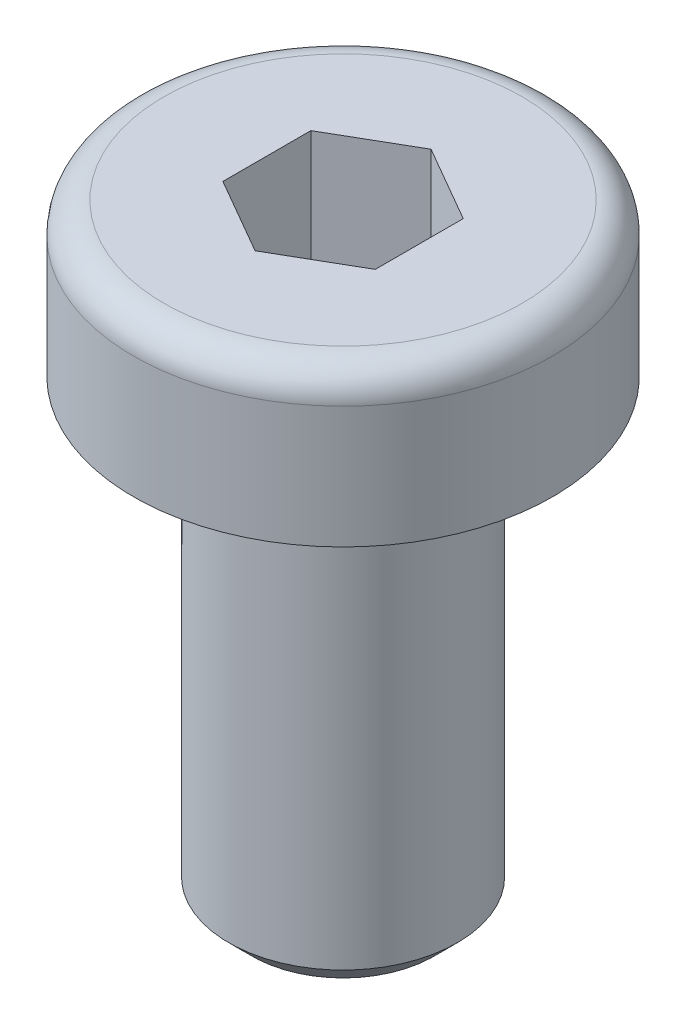
ISO-10303-21;
HEADER;
FILE_DESCRIPTION(('STEP AP214'),'2;1');
FILE_NAME('part.step','',(''),(''),'','','');
FILE_SCHEMA(('AUTOMOTIVE_DESIGN { 1 0 10303 214 1 1 1 1 }'));
ENDSEC;
DATA;
#1=APPLICATION_CONTEXT('core data for automotive mechanical design processes');
#2=APPLICATION_PROTOCOL_DEFINITION('international standard','automotive_design',2000,#1);
#3=PRODUCT_CONTEXT('',#1,'mechanical');
#4=PRODUCT('Part','Part','',(#3));
#5=PRODUCT_RELATED_PRODUCT_CATEGORY('part','',(#4));
#6=PRODUCT_DEFINITION_FORMATION('','',#4);
#7=PRODUCT_DEFINITION_CONTEXT('part definition',#1,'design');
#8=PRODUCT_DEFINITION('design','',#6,#7);
#9=PRODUCT_DEFINITION_SHAPE('','',#8);
#10=(LENGTH_UNIT() NAMED_UNIT(*) SI_UNIT(.MILLI.,.METRE.));
#11=(NAMED_UNIT(*) PLANE_ANGLE_UNIT() SI_UNIT($,.RADIAN.));
#12=(NAMED_UNIT(*) SI_UNIT($,.STERADIAN.) SOLID_ANGLE_UNIT());
#13=UNCERTAINTY_MEASURE_WITH_UNIT(LENGTH_MEASURE(1.E-05),#10,'distance_accuracy_value','');
#14=(GEOMETRIC_REPRESENTATION_CONTEXT(3) GLOBAL_UNCERTAINTY_ASSIGNED_CONTEXT((#13)) GLOBAL_UNIT_ASSIGNED_CONTEXT((#10,
#11,#12)) REPRESENTATION_CONTEXT('',''));
#15=CARTESIAN_POINT('',(0.,0.,0.));
#16=DIRECTION('',(0.,0.,1.));
#17=DIRECTION('',(1.,0.,0.));
#18=AXIS2_PLACEMENT_3D('',#15,#16,#17);
#19=CARTESIAN_POINT('',(0.,2.,0.));
#20=DIRECTION('',(0.,-1.,0.));
#21=DIRECTION('',(0.,0.,-1.));
#22=AXIS2_PLACEMENT_3D('',#19,#20,#21);
#23=PLANE('',#22);
#24=CARTESIAN_POINT('',(0.,2.,0.));
#25=DIRECTION('',(0.,-1.,0.));
#26=DIRECTION('',(0.,0.,-1.));
#27=AXIS2_PLACEMENT_3D('',#24,#25,#26);
#28=CIRCLE('',#27,2.3500000059604);
#29=CARTESIAN_POINT('',(0.,2.,-2.3500000059604));
#30=VERTEX_POINT('',#29);
#31=EDGE_CURVE('E92',#30,#30,#28,.T.);
#32=ORIENTED_EDGE('',*,*,#31,.F.);
#33=EDGE_LOOP('',(#32));
#34=FACE_BOUND('',#33,.T.);
#35=DIRECTION('',(0.,0.,1.));
#36=VECTOR('',#35,1.);
#37=CARTESIAN_POINT('',(-1.,2.,-0.57735026918963));
#38=LINE('',#37,#36);
#39=CARTESIAN_POINT('',(-1.,2.,-0.57735026918963));
#40=VERTEX_POINT('',#39);
#41=CARTESIAN_POINT('',(-1.,2.,0.57735026918963));
#42=VERTEX_POINT('',#41);
#43=EDGE_CURVE('E78',#40,#42,#38,.T.);
#44=ORIENTED_EDGE('',*,*,#43,.F.);
#45=DIRECTION('',(-0.866025403784422,0.,0.500000000000029));
#46=VECTOR('',#45,1.);
#47=CARTESIAN_POINT('',(0.,2.,-1.1547005383793));
#48=LINE('',#47,#46);
#49=CARTESIAN_POINT('',(0.,2.,-1.1547005383793));
#50=VERTEX_POINT('',#49);
#51=EDGE_CURVE('E67',#50,#40,#48,.T.);
#52=ORIENTED_EDGE('',*,*,#51,.F.);
#53=DIRECTION('',(-0.866025403784422,0.,-0.500000000000029));
#54=VECTOR('',#53,1.);
#55=CARTESIAN_POINT('',(1.,2.,-0.57735026918963));
#56=LINE('',#55,#54);
#57=CARTESIAN_POINT('',(1.,2.,-0.57735026918963));
#58=VERTEX_POINT('',#57);
#59=EDGE_CURVE('E77',#58,#50,#56,.T.);
#60=ORIENTED_EDGE('',*,*,#59,.F.);
#61=DIRECTION('',(0.,0.,-1.));
#62=VECTOR('',#61,1.);
#63=CARTESIAN_POINT('',(1.,2.,0.57735026918963));
#64=LINE('',#63,#62);
#65=CARTESIAN_POINT('',(1.,2.,0.57735026918963));
#66=VERTEX_POINT('',#65);
#67=EDGE_CURVE('E102',#66,#58,#64,.T.);
#68=ORIENTED_EDGE('',*,*,#67,.F.);
#69=DIRECTION('',(0.866025403784422,0.,-0.500000000000029));
#70=VECTOR('',#69,1.);
#71=CARTESIAN_POINT('',(0.,2.,1.1547005383793));
#72=LINE('',#71,#70);
#73=CARTESIAN_POINT('',(0.,2.,1.1547005383793));
#74=VERTEX_POINT('',#73);
#75=EDGE_CURVE('E107',#74,#66,#72,.T.);
#76=ORIENTED_EDGE('',*,*,#75,.F.);
#77=DIRECTION('',(0.866025403784422,0.,0.500000000000029));
#78=VECTOR('',#77,1.);
#79=CARTESIAN_POINT('',(-1.,2.,0.57735026918963));
#80=LINE('',#79,#78);
#81=EDGE_CURVE('E91',#42,#74,#80,.T.);
#82=ORIENTED_EDGE('',*,*,#81,.F.);
#83=EDGE_LOOP('',(#44,#52,#60,#68,#76,#82));
#84=FACE_BOUND('',#83,.T.);
#85=ADVANCED_FACE('F16',(#34,#84),#23,.F.);
#86=CARTESIAN_POINT('',(0.,1.59999999999994,0.));
#87=DIRECTION('',(0.,-1.,0.));
#88=DIRECTION('',(0.,0.,-1.));
#89=AXIS2_PLACEMENT_3D('',#86,#87,#88);
#90=TOROIDAL_SURFACE('',#89,2.34999999999994,0.400000000000065);
#91=ORIENTED_EDGE('',*,*,#31,.T.);
#92=EDGE_LOOP('',(#91));
#93=FACE_BOUND('',#92,.T.);
#94=CARTESIAN_POINT('',(0.,1.6,0.));
#95=DIRECTION('',(0.,-1.,0.));
#96=DIRECTION('',(0.,0.,-1.));
#97=AXIS2_PLACEMENT_3D('',#94,#95,#96);
#98=CIRCLE('',#97,2.75);
#99=CARTESIAN_POINT('',(0.,1.6,-2.75));
#100=VERTEX_POINT('',#99);
#101=EDGE_CURVE('E115',#100,#100,#98,.T.);
#102=ORIENTED_EDGE('',*,*,#101,.F.);
#103=EDGE_LOOP('',(#102));
#104=FACE_BOUND('',#103,.T.);
#105=ADVANCED_FACE('F190',(#93,#104),#90,.T.);
#106=CARTESIAN_POINT('',(0.,0.,0.));
#107=DIRECTION('',(0.,-1.,0.));
#108=DIRECTION('',(0.,0.,-1.));
#109=AXIS2_PLACEMENT_3D('',#106,#107,#108);
#110=CYLINDRICAL_SURFACE('',#109,2.75);
#111=CARTESIAN_POINT('',(0.,0.,0.));
#112=DIRECTION('',(0.,-1.,0.));
#113=DIRECTION('',(0.,0.,-1.));
#114=AXIS2_PLACEMENT_3D('',#111,#112,#113);
#115=CIRCLE('',#114,2.75);
#116=CARTESIAN_POINT('',(0.,0.,-2.75));
#117=VERTEX_POINT('',#116);
#118=EDGE_CURVE('E120',#117,#117,#115,.T.);
#119=ORIENTED_EDGE('',*,*,#118,.F.);
#120=EDGE_LOOP('',(#119));
#121=FACE_BOUND('',#120,.T.);
#122=ORIENTED_EDGE('',*,*,#101,.T.);
#123=EDGE_LOOP('',(#122));
#124=FACE_BOUND('',#123,.T.);
#125=ADVANCED_FACE('F184',(#121,#124),#110,.T.);
#126=CARTESIAN_POINT('',(2.75,0.,0.));
#127=DIRECTION('',(0.,1.,0.));
#128=DIRECTION('',(0.,0.,1.));
#129=AXIS2_PLACEMENT_3D('',#126,#127,#128);
#130=PLANE('',#129);
#131=CARTESIAN_POINT('',(0.,0.,0.));
#132=DIRECTION('',(0.,-1.,0.));
#133=DIRECTION('',(0.,0.,-1.));
#134=AXIS2_PLACEMENT_3D('',#131,#132,#133);
#135=CIRCLE('',#134,1.5);
#136=CARTESIAN_POINT('',(0.,0.,-1.5));
#137=VERTEX_POINT('',#136);
#138=EDGE_CURVE('E123',#137,#137,#135,.T.);
#139=ORIENTED_EDGE('',*,*,#138,.F.);
#140=EDGE_LOOP('',(#139));
#141=FACE_BOUND('',#140,.T.);
#142=ORIENTED_EDGE('',*,*,#118,.T.);
#143=EDGE_LOOP('',(#142));
#144=FACE_BOUND('',#143,.T.);
#145=ADVANCED_FACE('F181',(#141,#144),#130,.F.);
#146=CARTESIAN_POINT('',(-1.,3.5,-0.57735026918963));
#147=DIRECTION('',(1.,0.,0.));
#148=DIRECTION('',(0.,0.,-1.));
#149=AXIS2_PLACEMENT_3D('',#146,#147,#148);
#150=PLANE('',#149);
#151=ORIENTED_EDGE('',*,*,#43,.T.);
#152=DIRECTION('',(0.,-1.,0.));
#153=VECTOR('',#152,1.);
#154=CARTESIAN_POINT('',(-1.,2.,0.57735026918963));
#155=LINE('',#154,#153);
#156=CARTESIAN_POINT('',(-1.,0.5,0.57735026918963));
#157=VERTEX_POINT('',#156);
#158=EDGE_CURVE('E126',#42,#157,#155,.T.);
#159=ORIENTED_EDGE('',*,*,#158,.T.);
#160=DIRECTION('',(0.,0.,1.));
#161=VECTOR('',#160,1.);
#162=CARTESIAN_POINT('',(-1.,0.5,-0.57735026918963));
#163=LINE('',#162,#161);
#164=CARTESIAN_POINT('',(-1.,0.5,-0.57735026918963));
#165=VERTEX_POINT('',#164);
#166=EDGE_CURVE('E85',#165,#157,#163,.T.);
#167=ORIENTED_EDGE('',*,*,#166,.F.);
#168=DIRECTION('',(0.,-1.,0.));
#169=VECTOR('',#168,1.);
#170=CARTESIAN_POINT('',(-1.,2.,-0.57735026918963));
#171=LINE('',#170,#169);
#172=EDGE_CURVE('E70',#40,#165,#171,.T.);
#173=ORIENTED_EDGE('',*,*,#172,.F.);
#174=EDGE_LOOP('',(#151,#159,#167,#173));
#175=FACE_BOUND('',#174,.T.);
#176=ADVANCED_FACE('F83',(#175),#150,.T.);
#177=CARTESIAN_POINT('',(-1.,3.5,0.57735026918963));
#178=DIRECTION('',(0.500000000000029,0.,-0.866025403784422));
#179=DIRECTION('',(-0.866025403784422,0.,-0.500000000000029));
#180=AXIS2_PLACEMENT_3D('',#177,#178,#179);
#181=PLANE('',#180);
#182=ORIENTED_EDGE('',*,*,#81,.T.);
#183=DIRECTION('',(0.,-1.,0.));
#184=VECTOR('',#183,1.);
#185=CARTESIAN_POINT('',(0.,2.,1.1547005383793));
#186=LINE('',#185,#184);
#187=CARTESIAN_POINT('',(0.,0.5,1.1547005383793));
#188=VERTEX_POINT('',#187);
#189=EDGE_CURVE('E86',#74,#188,#186,.T.);
#190=ORIENTED_EDGE('',*,*,#189,.T.);
#191=DIRECTION('',(0.866025403784422,0.,0.500000000000029));
#192=VECTOR('',#191,1.);
#193=CARTESIAN_POINT('',(-1.,0.5,0.57735026918963));
#194=LINE('',#193,#192);
#195=EDGE_CURVE('E137',#157,#188,#194,.T.);
#196=ORIENTED_EDGE('',*,*,#195,.F.);
#197=ORIENTED_EDGE('',*,*,#158,.F.);
#198=EDGE_LOOP('',(#182,#190,#196,#197));
#199=FACE_BOUND('',#198,.T.);
#200=ADVANCED_FACE('F206',(#199),#181,.T.);
#201=CARTESIAN_POINT('',(0.,3.5,1.1547005383793));
#202=DIRECTION('',(-0.500000000000029,0.,-0.866025403784422));
#203=DIRECTION('',(-0.866025403784422,0.,0.500000000000029));
#204=AXIS2_PLACEMENT_3D('',#201,#202,#203);
#205=PLANE('',#204);
#206=ORIENTED_EDGE('',*,*,#75,.T.);
#207=DIRECTION('',(0.,-1.,0.));
#208=VECTOR('',#207,1.);
#209=CARTESIAN_POINT('',(1.,2.,0.57735026918963));
#210=LINE('',#209,#208);
#211=CARTESIAN_POINT('',(1.,0.5,0.57735026918963));
#212=VERTEX_POINT('',#211);
#213=EDGE_CURVE('E141',#66,#212,#210,.T.);
#214=ORIENTED_EDGE('',*,*,#213,.T.);
#215=DIRECTION('',(0.866025403784422,0.,-0.500000000000029));
#216=VECTOR('',#215,1.);
#217=CARTESIAN_POINT('',(0.,0.5,1.1547005383793));
#218=LINE('',#217,#216);
#219=EDGE_CURVE('E146',#188,#212,#218,.T.);
#220=ORIENTED_EDGE('',*,*,#219,.F.);
#221=ORIENTED_EDGE('',*,*,#189,.F.);
#222=EDGE_LOOP('',(#206,#214,#220,#221));
#223=FACE_BOUND('',#222,.T.);
#224=ADVANCED_FACE('F209',(#223),#205,.T.);
#225=CARTESIAN_POINT('',(1.,3.5,0.57735026918963));
#226=DIRECTION('',(-1.,0.,0.));
#227=DIRECTION('',(0.,0.,1.));
#228=AXIS2_PLACEMENT_3D('',#225,#226,#227);
#229=PLANE('',#228);
#230=ORIENTED_EDGE('',*,*,#67,.T.);
#231=DIRECTION('',(0.,-1.,0.));
#232=VECTOR('',#231,1.);
#233=CARTESIAN_POINT('',(1.,2.,-0.57735026918963));
#234=LINE('',#233,#232);
#235=CARTESIAN_POINT('',(1.,0.5,-0.57735026918963));
#236=VERTEX_POINT('',#235);
#237=EDGE_CURVE('E150',#58,#236,#234,.T.);
#238=ORIENTED_EDGE('',*,*,#237,.T.);
#239=DIRECTION('',(0.,0.,-1.));
#240=VECTOR('',#239,1.);
#241=CARTESIAN_POINT('',(1.,0.5,0.57735026918963));
#242=LINE('',#241,#240);
#243=EDGE_CURVE('E36',#212,#236,#242,.T.);
#244=ORIENTED_EDGE('',*,*,#243,.F.);
#245=ORIENTED_EDGE('',*,*,#213,.F.);
#246=EDGE_LOOP('',(#230,#238,#244,#245));
#247=FACE_BOUND('',#246,.T.);
#248=ADVANCED_FACE('F213',(#247),#229,.T.);
#249=CARTESIAN_POINT('',(1.,3.5,-0.57735026918963));
#250=DIRECTION('',(-0.500000000000029,0.,0.866025403784422));
#251=DIRECTION('',(0.866025403784422,0.,0.500000000000029));
#252=AXIS2_PLACEMENT_3D('',#249,#250,#251);
#253=PLANE('',#252);
#254=ORIENTED_EDGE('',*,*,#59,.T.);
#255=DIRECTION('',(0.,-1.,0.));
#256=VECTOR('',#255,1.);
#257=CARTESIAN_POINT('',(0.,2.,-1.1547005383793));
#258=LINE('',#257,#256);
#259=CARTESIAN_POINT('',(0.,0.5,-1.1547005383793));
#260=VERTEX_POINT('',#259);
#261=EDGE_CURVE('E72',#50,#260,#258,.T.);
#262=ORIENTED_EDGE('',*,*,#261,.T.);
#263=DIRECTION('',(-0.866025403784422,0.,-0.500000000000029));
#264=VECTOR('',#263,1.);
#265=CARTESIAN_POINT('',(1.,0.5,-0.57735026918963));
#266=LINE('',#265,#264);
#267=EDGE_CURVE('E31',#236,#260,#266,.T.);
#268=ORIENTED_EDGE('',*,*,#267,.F.);
#269=ORIENTED_EDGE('',*,*,#237,.F.);
#270=EDGE_LOOP('',(#254,#262,#268,#269));
#271=FACE_BOUND('',#270,.T.);
#272=ADVANCED_FACE('F217',(#271),#253,.T.);
#273=CARTESIAN_POINT('',(0.,3.5,-1.1547005383793));
#274=DIRECTION('',(0.500000000000029,0.,0.866025403784422));
#275=DIRECTION('',(0.866025403784422,0.,-0.500000000000029));
#276=AXIS2_PLACEMENT_3D('',#273,#274,#275);
#277=PLANE('',#276);
#278=ORIENTED_EDGE('',*,*,#51,.T.);
#279=ORIENTED_EDGE('',*,*,#172,.T.);
#280=DIRECTION('',(-0.866025403784422,0.,0.500000000000029));
#281=VECTOR('',#280,1.);
#282=CARTESIAN_POINT('',(0.,0.5,-1.1547005383793));
#283=LINE('',#282,#281);
#284=EDGE_CURVE('E164',#260,#165,#283,.T.);
#285=ORIENTED_EDGE('',*,*,#284,.F.);
#286=ORIENTED_EDGE('',*,*,#261,.F.);
#287=EDGE_LOOP('',(#278,#279,#285,#286));
#288=FACE_BOUND('',#287,.T.);
#289=ADVANCED_FACE('F69',(#288),#277,.T.);
#290=CARTESIAN_POINT('',(0.,0.5,0.));
#291=DIRECTION('',(0.,1.,0.));
#292=DIRECTION('',(0.,0.,1.));
#293=AXIS2_PLACEMENT_3D('',#290,#291,#292);
#294=PLANE('',#293);
#295=ORIENTED_EDGE('',*,*,#166,.T.);
#296=ORIENTED_EDGE('',*,*,#195,.T.);
#297=ORIENTED_EDGE('',*,*,#219,.T.);
#298=ORIENTED_EDGE('',*,*,#243,.T.);
#299=ORIENTED_EDGE('',*,*,#267,.T.);
#300=ORIENTED_EDGE('',*,*,#284,.T.);
#301=EDGE_LOOP('',(#295,#296,#297,#298,#299,#300));
#302=FACE_BOUND('',#301,.T.);
#303=ADVANCED_FACE('F177',(#302),#294,.T.);
#304=CARTESIAN_POINT('',(0.,-6.,0.));
#305=DIRECTION('',(0.,-1.,0.));
#306=DIRECTION('',(0.,0.,-1.));
#307=AXIS2_PLACEMENT_3D('',#304,#305,#306);
#308=CYLINDRICAL_SURFACE('',#307,1.5);
#309=CARTESIAN_POINT('',(0.,-5.6935,0.));
#310=DIRECTION('',(0.,-1.,0.));
#311=DIRECTION('',(0.,0.,-1.));
#312=AXIS2_PLACEMENT_3D('',#309,#310,#311);
#313=CIRCLE('',#312,1.5);
#314=CARTESIAN_POINT('',(0.,-5.6935,-1.5));
#315=VERTEX_POINT('',#314);
#316=EDGE_CURVE('E24',#315,#315,#313,.T.);
#317=ORIENTED_EDGE('',*,*,#316,.F.);
#318=EDGE_LOOP('',(#317));
#319=FACE_BOUND('',#318,.T.);
#320=ORIENTED_EDGE('',*,*,#138,.T.);
#321=EDGE_LOOP('',(#320));
#322=FACE_BOUND('',#321,.T.);
#323=ADVANCED_FACE('F174',(#319,#322),#308,.T.);
#324=CARTESIAN_POINT('',(0.,-5.6935,0.));
#325=DIRECTION('',(0.,1.,0.));
#326=DIRECTION('',(0.,0.,1.));
#327=AXIS2_PLACEMENT_3D('',#324,#325,#326);
#328=CONICAL_SURFACE('',#327,1.5,0.785398163397449);
#329=CARTESIAN_POINT('',(0.,-6.,0.));
#330=DIRECTION('',(0.,-1.,0.));
#331=DIRECTION('',(0.,0.,-1.));
#332=AXIS2_PLACEMENT_3D('',#329,#330,#331);
#333=CIRCLE('',#332,1.1935);
#334=CARTESIAN_POINT('',(0.,-6.,-1.1935));
#335=VERTEX_POINT('',#334);
#336=EDGE_CURVE('E10',#335,#335,#333,.T.);
#337=ORIENTED_EDGE('',*,*,#336,.F.);
#338=EDGE_LOOP('',(#337));
#339=FACE_BOUND('',#338,.T.);
#340=ORIENTED_EDGE('',*,*,#316,.T.);
#341=EDGE_LOOP('',(#340));
#342=FACE_BOUND('',#341,.T.);
#343=ADVANCED_FACE('F172',(#339,#342),#328,.T.);
#344=CARTESIAN_POINT('',(1.1935,-6.,0.));
#345=DIRECTION('',(0.,1.,0.));
#346=DIRECTION('',(0.,0.,1.));
#347=AXIS2_PLACEMENT_3D('',#344,#345,#346);
#348=PLANE('',#347);
#349=ORIENTED_EDGE('',*,*,#336,.T.);
#350=EDGE_LOOP('',(#349));
#351=FACE_BOUND('',#350,.T.);
#352=ADVANCED_FACE('F18',(#351),#348,.F.);
#353=CLOSED_SHELL('',(#85,#105,#125,#145,#176,#200,#224,#248,#272,#289,#303,#323,#343,#352));
#354=MANIFOLD_SOLID_BREP('B1',#353);
#355=ADVANCED_BREP_SHAPE_REPRESENTATION('',(#18,#354),#14);
#356=SHAPE_DEFINITION_REPRESENTATION(#9,#355);
ENDSEC;
END-ISO-10303-21;
